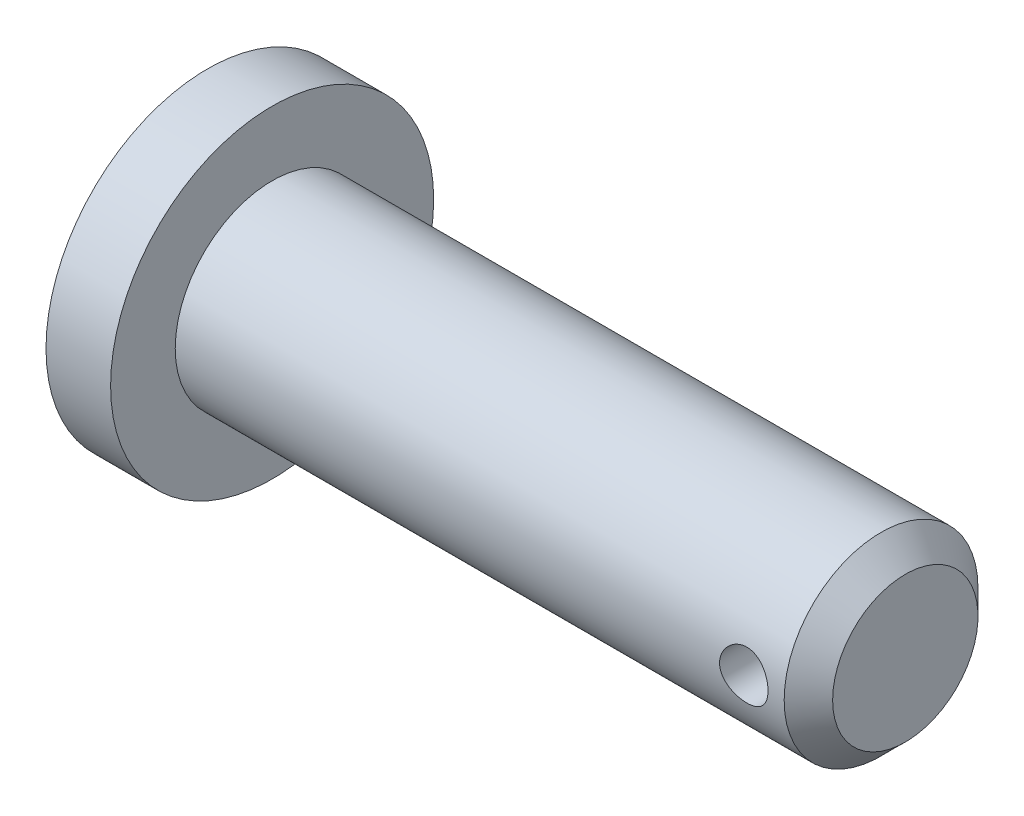
ISO-10303-21;
HEADER;
FILE_DESCRIPTION(('STEP AP214'),'2;1');
FILE_NAME('part.step','',(''),(''),'','','');
FILE_SCHEMA(('AUTOMOTIVE_DESIGN { 1 0 10303 214 1 1 1 1 }'));
ENDSEC;
DATA;
#1=APPLICATION_CONTEXT('core data for automotive mechanical design processes');
#2=APPLICATION_PROTOCOL_DEFINITION('international standard','automotive_design',2000,#1);
#3=PRODUCT_CONTEXT('',#1,'mechanical');
#4=PRODUCT('Part','Part','',(#3));
#5=PRODUCT_RELATED_PRODUCT_CATEGORY('part','',(#4));
#6=PRODUCT_DEFINITION_FORMATION('','',#4);
#7=PRODUCT_DEFINITION_CONTEXT('part definition',#1,'design');
#8=PRODUCT_DEFINITION('design','',#6,#7);
#9=PRODUCT_DEFINITION_SHAPE('','',#8);
#10=(LENGTH_UNIT() NAMED_UNIT(*) SI_UNIT(.MILLI.,.METRE.));
#11=(NAMED_UNIT(*) PLANE_ANGLE_UNIT() SI_UNIT($,.RADIAN.));
#12=(NAMED_UNIT(*) SI_UNIT($,.STERADIAN.) SOLID_ANGLE_UNIT());
#13=UNCERTAINTY_MEASURE_WITH_UNIT(LENGTH_MEASURE(1.E-05),#10,'distance_accuracy_value','');
#14=(GEOMETRIC_REPRESENTATION_CONTEXT(3) GLOBAL_UNCERTAINTY_ASSIGNED_CONTEXT((#13)) GLOBAL_UNIT_ASSIGNED_CONTEXT((#10,
#11,#12)) REPRESENTATION_CONTEXT('',''));
#15=CARTESIAN_POINT('',(0.,0.,0.));
#16=DIRECTION('',(0.,0.,1.));
#17=DIRECTION('',(1.,0.,0.));
#18=AXIS2_PLACEMENT_3D('',#15,#16,#17);
#19=CARTESIAN_POINT('',(-34.29,0.,0.));
#20=DIRECTION('',(1.,0.,0.));
#21=DIRECTION('',(0.,0.,-1.));
#22=AXIS2_PLACEMENT_3D('',#19,#20,#21);
#23=PLANE('',#22);
#24=CARTESIAN_POINT('',(-34.29,0.,0.));
#25=DIRECTION('',(-1.,0.,0.));
#26=DIRECTION('',(0.,0.,1.));
#27=AXIS2_PLACEMENT_3D('',#24,#25,#26);
#28=CIRCLE('',#27,15.875);
#29=CARTESIAN_POINT('',(-34.29,0.,15.875));
#30=VERTEX_POINT('',#29);
#31=EDGE_CURVE('E41',#30,#30,#28,.T.);
#32=ORIENTED_EDGE('',*,*,#31,.T.);
#33=EDGE_LOOP('',(#32));
#34=FACE_BOUND('',#33,.T.);
#35=ADVANCED_FACE('F30',(#34),#23,.F.);
#36=CARTESIAN_POINT('',(-34.29,0.,0.));
#37=DIRECTION('',(-1.,0.,0.));
#38=DIRECTION('',(0.,0.,1.));
#39=AXIS2_PLACEMENT_3D('',#36,#37,#38);
#40=CYLINDRICAL_SURFACE('',#39,15.875);
#41=ORIENTED_EDGE('',*,*,#31,.F.);
#42=EDGE_LOOP('',(#41));
#43=FACE_BOUND('',#42,.T.);
#44=CARTESIAN_POINT('',(-27.94,0.,0.));
#45=DIRECTION('',(-1.,0.,0.));
#46=DIRECTION('',(0.,0.,1.));
#47=AXIS2_PLACEMENT_3D('',#44,#45,#46);
#48=CIRCLE('',#47,15.875);
#49=CARTESIAN_POINT('',(-27.94,0.,15.875));
#50=VERTEX_POINT('',#49);
#51=EDGE_CURVE('E45',#50,#50,#48,.T.);
#52=ORIENTED_EDGE('',*,*,#51,.T.);
#53=EDGE_LOOP('',(#52));
#54=FACE_BOUND('',#53,.T.);
#55=ADVANCED_FACE('F75',(#43,#54),#40,.T.);
#56=CARTESIAN_POINT('',(-27.94,15.875,0.));
#57=DIRECTION('',(-1.,0.,0.));
#58=DIRECTION('',(0.,0.,1.));
#59=AXIS2_PLACEMENT_3D('',#56,#57,#58);
#60=PLANE('',#59);
#61=ORIENTED_EDGE('',*,*,#51,.F.);
#62=EDGE_LOOP('',(#61));
#63=FACE_BOUND('',#62,.T.);
#64=CARTESIAN_POINT('',(-27.94,0.,0.));
#65=DIRECTION('',(-1.,0.,0.));
#66=DIRECTION('',(0.,0.,1.));
#67=AXIS2_PLACEMENT_3D('',#64,#65,#66);
#68=CIRCLE('',#67,9.525);
#69=CARTESIAN_POINT('',(-27.94,0.,9.525));
#70=VERTEX_POINT('',#69);
#71=EDGE_CURVE('E55',#70,#70,#68,.T.);
#72=ORIENTED_EDGE('',*,*,#71,.T.);
#73=EDGE_LOOP('',(#72));
#74=FACE_BOUND('',#73,.T.);
#75=ADVANCED_FACE('F73',(#63,#74),#60,.F.);
#76=CARTESIAN_POINT('',(-34.29,0.,0.));
#77=DIRECTION('',(-1.,0.,0.));
#78=DIRECTION('',(0.,0.,1.));
#79=AXIS2_PLACEMENT_3D('',#76,#77,#78);
#80=CYLINDRICAL_SURFACE('',#79,9.525);
#81=CARTESIAN_POINT('',(31.90875,0.,0.));
#82=DIRECTION('',(-1.,0.,0.));
#83=DIRECTION('',(0.,0.,1.));
#84=AXIS2_PLACEMENT_3D('',#81,#82,#83);
#85=CIRCLE('',#84,9.525);
#86=CARTESIAN_POINT('',(31.90875,0.,9.525));
#87=VERTEX_POINT('',#86);
#88=EDGE_CURVE('E37',#87,#87,#85,.T.);
#89=ORIENTED_EDGE('',*,*,#88,.T.);
#90=EDGE_LOOP('',(#89));
#91=FACE_BOUND('',#90,.T.);
#92=CARTESIAN_POINT('',(30.32125,0.,9.525));
#93=CARTESIAN_POINT('',(30.3212463078907,-0.131565790763198,9.52499777540469));
#94=CARTESIAN_POINT('',(30.3103096631466,-0.263172825556336,9.52224692784274));
#95=CARTESIAN_POINT('',(30.2669175723001,-0.522615038985721,9.51153980704957));
#96=CARTESIAN_POINT('',(30.2344499298587,-0.650448036907299,9.50358058354212));
#97=CARTESIAN_POINT('',(30.1491026851289,-0.898558134589841,9.48333806802101));
#98=CARTESIAN_POINT('',(30.0962475945395,-1.01884410694513,9.47105997011768));
#99=CARTESIAN_POINT('',(29.9717120433038,-1.24884200939828,9.44348733294599));
#100=CARTESIAN_POINT('',(29.9000309476611,-1.35855358265366,9.42819269193473));
#101=CARTESIAN_POINT('',(29.738318746424,-1.5665480595902,9.39589519076813));
#102=CARTESIAN_POINT('',(29.6479728747525,-1.66458215797193,9.3788659759765));
#103=CARTESIAN_POINT('',(29.4521696247069,-1.84427642193527,9.34519371937224));
#104=CARTESIAN_POINT('',(29.3467105423217,-1.92593473865684,9.32855072135165));
#105=CARTESIAN_POINT('',(29.121742577555,-2.07172963669337,9.29726956420843));
#106=CARTESIAN_POINT('',(29.0020482460911,-2.13558789278116,9.28266486212887));
#107=CARTESIAN_POINT('',(28.7531993964897,-2.24218009232431,9.25749823023601));
#108=CARTESIAN_POINT('',(28.6240463945854,-2.28491741301122,9.24693565414889));
#109=CARTESIAN_POINT('',(28.3626821966049,-2.34720580342757,9.23132006755413));
#110=CARTESIAN_POINT('',(28.2305841025397,-2.36720422597714,9.22616091957755));
#111=CARTESIAN_POINT('',(27.9648148967135,-2.38484056791792,9.22161862904601));
#112=CARTESIAN_POINT('',(27.8311440444012,-2.38248212513625,9.22223454679337));
#113=CARTESIAN_POINT('',(27.5694524052042,-2.35582860786553,9.22907738757947));
#114=CARTESIAN_POINT('',(27.4413732009238,-2.33206661505263,9.23516795024078));
#115=CARTESIAN_POINT('',(27.1910793316787,-2.2641308967085,9.25205651602822));
#116=CARTESIAN_POINT('',(27.0688650851916,-2.21995571703516,9.26285485451166));
#117=CARTESIAN_POINT('',(26.8323408991997,-2.11199329622528,9.28806743325234));
#118=CARTESIAN_POINT('',(26.718123202284,-2.04801258423226,9.30251707358333));
#119=CARTESIAN_POINT('',(26.501854048261,-1.90239058817373,9.33338415968011));
#120=CARTESIAN_POINT('',(26.3998047249432,-1.82074621373403,9.34980194956222));
#121=CARTESIAN_POINT('',(26.2077142600851,-1.63935318668144,9.38332960357078));
#122=CARTESIAN_POINT('',(26.1180984970276,-1.5391546848383,9.40044585296326));
#123=CARTESIAN_POINT('',(25.9568612775885,-1.32494641903712,9.43301970356275));
#124=CARTESIAN_POINT('',(25.8852403708566,-1.21093623336136,9.44847725409684));
#125=CARTESIAN_POINT('',(25.7618696943688,-0.971733973281711,9.47606899699527));
#126=CARTESIAN_POINT('',(25.7101890223461,-0.84650483671869,9.48819159202767));
#127=CARTESIAN_POINT('',(25.628731277186,-0.588765662926826,9.50766318223874));
#128=CARTESIAN_POINT('',(25.5989500141862,-0.456257023651393,9.51501309051108));
#129=CARTESIAN_POINT('',(25.5627861146753,-0.191357202994166,9.52397605093307));
#130=CARTESIAN_POINT('',(25.5558241961054,-0.0590497929812821,9.5257310994439));
#131=CARTESIAN_POINT('',(25.5639077907631,0.204839688747396,9.52371102642943));
#132=CARTESIAN_POINT('',(25.5789513229436,0.336421824685797,9.51993640271441));
#133=CARTESIAN_POINT('',(25.6301413170713,0.59311265168268,9.50737210039669));
#134=CARTESIAN_POINT('',(25.6659717557697,0.718288376362892,9.49865756769938));
#135=CARTESIAN_POINT('',(25.7573574958952,0.96084595176837,9.47719571781724));
#136=CARTESIAN_POINT('',(25.8129147893472,1.07822701396434,9.46444799337342));
#137=CARTESIAN_POINT('',(25.9432998545885,1.30416797590736,9.43599376332878));
#138=CARTESIAN_POINT('',(26.0184520784295,1.41253438891428,9.42023876944477));
#139=CARTESIAN_POINT('',(26.1854789802155,1.61532349915876,9.38759408335556));
#140=CARTESIAN_POINT('',(26.277356544143,1.70974378487003,9.37070419564053));
#141=CARTESIAN_POINT('',(26.4779156128394,1.88434752681507,9.33718219173204));
#142=CARTESIAN_POINT('',(26.5869542285118,1.9641246398485,9.32056657889684));
#143=CARTESIAN_POINT('',(26.8172130572189,2.10424832993413,9.28993694431491));
#144=CARTESIAN_POINT('',(26.9384327292156,2.16459576948123,9.27592280709881));
#145=CARTESIAN_POINT('',(27.1889628343199,2.26369788021415,9.25223725362918));
#146=CARTESIAN_POINT('',(27.3182201099458,2.30258047967169,9.24254017670458));
#147=CARTESIAN_POINT('',(27.5817165500953,2.35798623515941,9.22856206138023));
#148=CARTESIAN_POINT('',(27.7159546184965,2.37451428111801,9.22427983852602));
#149=CARTESIAN_POINT('',(27.9814671253803,2.38448626215919,9.22170655688286));
#150=CARTESIAN_POINT('',(28.1127159282632,2.378579662727,9.22324693213353));
#151=CARTESIAN_POINT('',(28.3722824232577,2.34533642932061,9.23175555542716));
#152=CARTESIAN_POINT('',(28.5006001742209,2.31800022601496,9.23872369438889));
#153=CARTESIAN_POINT('',(28.749955928767,2.24302846961572,9.25720876335744));
#154=CARTESIAN_POINT('',(28.871032722069,2.19551472993017,9.26869836688157));
#155=CARTESIAN_POINT('',(29.1035825450578,2.08163305034797,9.2949356221265));
#156=CARTESIAN_POINT('',(29.2150542399342,2.01526249542925,9.30968372566587));
#157=CARTESIAN_POINT('',(29.4283679735408,1.86351505096148,9.34125694393469));
#158=CARTESIAN_POINT('',(29.5298829540605,1.77768752112321,9.35812620420453));
#159=CARTESIAN_POINT('',(29.7172809336127,1.5903406267637,9.3917774325344));
#160=CARTESIAN_POINT('',(29.8031602153043,1.48881754125207,9.40855937891697));
#161=CARTESIAN_POINT('',(29.9583654523463,1.27074229389037,9.44050778340675));
#162=CARTESIAN_POINT('',(30.0273634492036,1.15395124542727,9.45563947968319));
#163=CARTESIAN_POINT('',(30.1446365974181,0.910059869472881,9.48221568397998));
#164=CARTESIAN_POINT('',(30.1929265975295,0.782967006955824,9.49366283254652));
#165=CARTESIAN_POINT('',(30.2602452806483,0.546751277024011,9.50988794560298));
#166=CARTESIAN_POINT('',(30.2830725983473,0.438753521316558,9.51551603771146));
#167=CARTESIAN_POINT('',(30.3135759354998,0.220513388563849,9.52307285805718));
#168=CARTESIAN_POINT('',(30.3212530945222,0.110271180972653,9.52500186453295));
#169=CARTESIAN_POINT('',(30.32125,0.,9.525));
#170=B_SPLINE_CURVE_WITH_KNOTS('',3,(#92,#93,#94,#95,#96,#97,#98,#99,#100,#101,#102,#103,#104,
#105,#106,#107,#108,#109,#110,#111,#112,#113,#114,#115,#116,#117,#118,#119,#120,#121,#122,#123,
#124,#125,#126,#127,#128,#129,#130,#131,#132,#133,#134,#135,#136,#137,#138,#139,#140,#141,#142,
#143,#144,#145,#146,#147,#148,#149,#150,#151,#152,#153,#154,#155,#156,#157,#158,#159,#160,#161,
#162,#163,#164,#165,#166,#167,#168,#169),.UNSPECIFIED.,.T.,.F.,(4,2,2,2,2,2,2,2,2,2,2,2,2,2,2,2,
2,2,2,2,2,2,2,2,2,2,2,2,2,2,2,2,2,2,2,2,2,2,4),(0.,0.394293268549125,0.788810077450191,
1.18285403237919,1.57691128001881,1.97825416256458,2.37964233208348,2.78699352978968,
3.19427957106372,3.59340618472948,3.99246785509178,4.38185714003913,4.77127416757608,
5.16462213005055,5.5580389670768,5.9626738279359,6.36732104678989,6.77335813557241,
7.17931751985993,7.57488815462248,7.97042318021751,8.36009685796307,8.74980989629409,
9.14643820265269,9.54313501280503,9.94956908367378,10.3559851102012,10.75995204207,
11.1638305942253,11.5561075139213,11.9483765502704,12.3383103589746,12.7282982692666,
13.1284595256007,13.5287157951987,13.9362209448993,14.3434334007573,14.6739331067999,
15.0044079522766),.UNSPECIFIED.);
#171=CARTESIAN_POINT('',(30.32125,0.,9.525));
#172=VERTEX_POINT('',#171);
#173=EDGE_CURVE('E48',#172,#172,#170,.T.);
#174=ORIENTED_EDGE('',*,*,#173,.T.);
#175=EDGE_LOOP('',(#174));
#176=FACE_BOUND('',#175,.T.);
#177=CARTESIAN_POINT('',(30.32125,0.,-9.525));
#178=CARTESIAN_POINT('',(30.3212463078907,0.131565790763198,-9.52499777540469));
#179=CARTESIAN_POINT('',(30.3103096631466,0.263172825556337,-9.52224692784274));
#180=CARTESIAN_POINT('',(30.2669175723001,0.522615038985721,-9.51153980704957));
#181=CARTESIAN_POINT('',(30.2344499298587,0.650448036907299,-9.50358058354212));
#182=CARTESIAN_POINT('',(30.1491026851289,0.898558134589842,-9.48333806802101));
#183=CARTESIAN_POINT('',(30.0962475945395,1.01884410694513,-9.47105997011768));
#184=CARTESIAN_POINT('',(29.9717120433038,1.24884200939828,-9.44348733294599));
#185=CARTESIAN_POINT('',(29.9000309476611,1.35855358265366,-9.42819269193473));
#186=CARTESIAN_POINT('',(29.738318746424,1.5665480595902,-9.39589519076813));
#187=CARTESIAN_POINT('',(29.6479728747525,1.66458215797193,-9.3788659759765));
#188=CARTESIAN_POINT('',(29.4521696247069,1.84427642193527,-9.34519371937224));
#189=CARTESIAN_POINT('',(29.3467105423217,1.92593473865684,-9.32855072135165));
#190=CARTESIAN_POINT('',(29.121742577555,2.07172963669338,-9.29726956420842));
#191=CARTESIAN_POINT('',(29.0020482460911,2.13558789278116,-9.28266486212887));
#192=CARTESIAN_POINT('',(28.7531993964897,2.24218009232431,-9.25749823023601));
#193=CARTESIAN_POINT('',(28.6240463945854,2.28491741301123,-9.24693565414889));
#194=CARTESIAN_POINT('',(28.3626821966049,2.34720580342757,-9.23132006755413));
#195=CARTESIAN_POINT('',(28.2305841025397,2.36720422597714,-9.22616091957755));
#196=CARTESIAN_POINT('',(27.9648148967135,2.38484056791792,-9.22161862904601));
#197=CARTESIAN_POINT('',(27.8311440444012,2.38248212513625,-9.22223454679337));
#198=CARTESIAN_POINT('',(27.5694524052042,2.35582860786553,-9.22907738757947));
#199=CARTESIAN_POINT('',(27.4413732009238,2.33206661505263,-9.23516795024078));
#200=CARTESIAN_POINT('',(27.1910793316787,2.2641308967085,-9.25205651602822));
#201=CARTESIAN_POINT('',(27.0688650851916,2.21995571703516,-9.26285485451166));
#202=CARTESIAN_POINT('',(26.8323408991997,2.11199329622528,-9.28806743325234));
#203=CARTESIAN_POINT('',(26.718123202284,2.04801258423226,-9.30251707358333));
#204=CARTESIAN_POINT('',(26.501854048261,1.90239058817373,-9.33338415968011));
#205=CARTESIAN_POINT('',(26.3998047249432,1.82074621373403,-9.34980194956222));
#206=CARTESIAN_POINT('',(26.2077142600851,1.63935318668144,-9.38332960357078));
#207=CARTESIAN_POINT('',(26.1180984970276,1.5391546848383,-9.40044585296326));
#208=CARTESIAN_POINT('',(25.9568612775885,1.32494641903712,-9.43301970356275));
#209=CARTESIAN_POINT('',(25.8852403708566,1.21093623336136,-9.44847725409684));
#210=CARTESIAN_POINT('',(25.7618696943688,0.971733973281711,-9.47606899699527));
#211=CARTESIAN_POINT('',(25.7101890223461,0.84650483671869,-9.48819159202767));
#212=CARTESIAN_POINT('',(25.628731277186,0.588765662926826,-9.50766318223874));
#213=CARTESIAN_POINT('',(25.5989500141862,0.456257023651393,-9.51501309051108));
#214=CARTESIAN_POINT('',(25.5627861146753,0.191357202994166,-9.52397605093307));
#215=CARTESIAN_POINT('',(25.5558241961054,0.0590497929812826,-9.5257310994439));
#216=CARTESIAN_POINT('',(25.5639077907631,-0.204839688747395,-9.52371102642943));
#217=CARTESIAN_POINT('',(25.5789513229436,-0.336421824685797,-9.51993640271441));
#218=CARTESIAN_POINT('',(25.6301413170713,-0.59311265168268,-9.50737210039669));
#219=CARTESIAN_POINT('',(25.6659717557697,-0.718288376362892,-9.49865756769938));
#220=CARTESIAN_POINT('',(25.7573574958952,-0.960845951768371,-9.47719571781724));
#221=CARTESIAN_POINT('',(25.8129147893472,-1.07822701396434,-9.46444799337342));
#222=CARTESIAN_POINT('',(25.9432998545885,-1.30416797590736,-9.43599376332878));
#223=CARTESIAN_POINT('',(26.0184520784295,-1.41253438891428,-9.42023876944477));
#224=CARTESIAN_POINT('',(26.1854789802155,-1.61532349915876,-9.38759408335556));
#225=CARTESIAN_POINT('',(26.277356544143,-1.70974378487003,-9.37070419564053));
#226=CARTESIAN_POINT('',(26.4779156128394,-1.88434752681507,-9.33718219173204));
#227=CARTESIAN_POINT('',(26.5869542285118,-1.9641246398485,-9.32056657889684));
#228=CARTESIAN_POINT('',(26.8172130572189,-2.10424832993413,-9.28993694431491));
#229=CARTESIAN_POINT('',(26.9384327292156,-2.16459576948123,-9.27592280709881));
#230=CARTESIAN_POINT('',(27.1889628343199,-2.26369788021415,-9.25223725362918));
#231=CARTESIAN_POINT('',(27.3182201099458,-2.30258047967169,-9.24254017670458));
#232=CARTESIAN_POINT('',(27.5817165500953,-2.35798623515941,-9.22856206138023));
#233=CARTESIAN_POINT('',(27.7159546184965,-2.37451428111801,-9.22427983852602));
#234=CARTESIAN_POINT('',(27.9814671253803,-2.38448626215919,-9.22170655688286));
#235=CARTESIAN_POINT('',(28.1127159282632,-2.378579662727,-9.22324693213353));
#236=CARTESIAN_POINT('',(28.3722824232577,-2.34533642932061,-9.23175555542716));
#237=CARTESIAN_POINT('',(28.5006001742209,-2.31800022601496,-9.23872369438889));
#238=CARTESIAN_POINT('',(28.749955928767,-2.24302846961572,-9.25720876335744));
#239=CARTESIAN_POINT('',(28.871032722069,-2.19551472993017,-9.26869836688157));
#240=CARTESIAN_POINT('',(29.1035825450578,-2.08163305034797,-9.2949356221265));
#241=CARTESIAN_POINT('',(29.2150542399342,-2.01526249542925,-9.30968372566587));
#242=CARTESIAN_POINT('',(29.4283679735408,-1.86351505096148,-9.34125694393469));
#243=CARTESIAN_POINT('',(29.5298829540605,-1.77768752112321,-9.35812620420453));
#244=CARTESIAN_POINT('',(29.7172809336127,-1.5903406267637,-9.3917774325344));
#245=CARTESIAN_POINT('',(29.8031602153043,-1.48881754125207,-9.40855937891697));
#246=CARTESIAN_POINT('',(29.9583654523463,-1.27074229389037,-9.44050778340675));
#247=CARTESIAN_POINT('',(30.0273634492036,-1.15395124542727,-9.45563947968319));
#248=CARTESIAN_POINT('',(30.1446365974181,-0.910059869472881,-9.48221568397998));
#249=CARTESIAN_POINT('',(30.1929265975295,-0.782967006955824,-9.49366283254652));
#250=CARTESIAN_POINT('',(30.2602452806483,-0.546751277024011,-9.50988794560298));
#251=CARTESIAN_POINT('',(30.2830725983473,-0.438753521316559,-9.51551603771146));
#252=CARTESIAN_POINT('',(30.3135759354998,-0.220513388563849,-9.52307285805718));
#253=CARTESIAN_POINT('',(30.3212530945222,-0.110271180972653,-9.52500186453295));
#254=CARTESIAN_POINT('',(30.32125,0.,-9.525));
#255=B_SPLINE_CURVE_WITH_KNOTS('',3,(#177,#178,#179,#180,#181,#182,#183,#184,#185,#186,#187,
#188,#189,#190,#191,#192,#193,#194,#195,#196,#197,#198,#199,#200,#201,#202,#203,#204,#205,#206,
#207,#208,#209,#210,#211,#212,#213,#214,#215,#216,#217,#218,#219,#220,#221,#222,#223,#224,#225,
#226,#227,#228,#229,#230,#231,#232,#233,#234,#235,#236,#237,#238,#239,#240,#241,#242,#243,#244,
#245,#246,#247,#248,#249,#250,#251,#252,#253,#254),.UNSPECIFIED.,.T.,.F.,(4,2,2,2,2,2,2,2,2,2,2,
2,2,2,2,2,2,2,2,2,2,2,2,2,2,2,2,2,2,2,2,2,2,2,2,2,2,2,4),(0.,0.394293268549125,
0.788810077450191,1.1828540323792,1.57691128001881,1.97825416256458,2.37964233208349,
2.78699352978969,3.19427957106372,3.59340618472948,3.99246785509178,4.38185714003912,
4.77127416757608,5.16462213005055,5.5580389670768,5.9626738279359,6.36732104678989,
6.77335813557241,7.17931751985993,7.57488815462248,7.97042318021751,8.36009685796307,
8.74980989629409,9.14643820265269,9.54313501280503,9.94956908367378,10.3559851102012,
10.75995204207,11.1638305942253,11.5561075139213,11.9483765502704,12.3383103589746,
12.7282982692666,13.1284595256007,13.5287157951987,13.9362209448993,14.3434334007573,
14.6739331067999,15.0044079522766),.UNSPECIFIED.);
#256=CARTESIAN_POINT('',(30.32125,0.,-9.525));
#257=VERTEX_POINT('',#256);
#258=EDGE_CURVE('E56',#257,#257,#255,.T.);
#259=ORIENTED_EDGE('',*,*,#258,.T.);
#260=EDGE_LOOP('',(#259));
#261=FACE_BOUND('',#260,.T.);
#262=ORIENTED_EDGE('',*,*,#71,.F.);
#263=EDGE_LOOP('',(#262));
#264=FACE_BOUND('',#263,.T.);
#265=ADVANCED_FACE('F59',(#91,#176,#261,#264),#80,.T.);
#266=CARTESIAN_POINT('',(34.29,9.525,0.));
#267=DIRECTION('',(-1.,0.,0.));
#268=DIRECTION('',(0.,0.,1.));
#269=AXIS2_PLACEMENT_3D('',#266,#267,#268);
#270=PLANE('',#269);
#271=CARTESIAN_POINT('',(34.29,0.,0.));
#272=DIRECTION('',(-1.,0.,0.));
#273=DIRECTION('',(0.,0.,1.));
#274=AXIS2_PLACEMENT_3D('',#271,#272,#273);
#275=CIRCLE('',#274,7.14375000000003);
#276=CARTESIAN_POINT('',(34.29,0.,7.14375000000003));
#277=VERTEX_POINT('',#276);
#278=EDGE_CURVE('E10',#277,#277,#275,.F.);
#279=ORIENTED_EDGE('',*,*,#278,.T.);
#280=EDGE_LOOP('',(#279));
#281=FACE_BOUND('',#280,.T.);
#282=ADVANCED_FACE('F66',(#281),#270,.F.);
#283=CARTESIAN_POINT('',(27.94,0.,-15.875));
#284=DIRECTION('',(0.,0.,1.));
#285=DIRECTION('',(1.,0.,0.));
#286=AXIS2_PLACEMENT_3D('',#283,#284,#285);
#287=CYLINDRICAL_SURFACE('',#286,2.38125);
#288=ORIENTED_EDGE('',*,*,#258,.F.);
#289=EDGE_LOOP('',(#288));
#290=FACE_BOUND('',#289,.T.);
#291=ORIENTED_EDGE('',*,*,#173,.F.);
#292=EDGE_LOOP('',(#291));
#293=FACE_BOUND('',#292,.T.);
#294=ADVANCED_FACE('F63',(#290,#293),#287,.F.);
#295=CARTESIAN_POINT('',(31.90875,0.,0.));
#296=DIRECTION('',(-1.,0.,0.));
#297=DIRECTION('',(0.,0.,1.));
#298=AXIS2_PLACEMENT_3D('',#295,#296,#297);
#299=CONICAL_SURFACE('',#298,9.525,0.78539816339745);
#300=ORIENTED_EDGE('',*,*,#278,.F.);
#301=EDGE_LOOP('',(#300));
#302=FACE_BOUND('',#301,.T.);
#303=ORIENTED_EDGE('',*,*,#88,.F.);
#304=EDGE_LOOP('',(#303));
#305=FACE_BOUND('',#304,.T.);
#306=ADVANCED_FACE('F32',(#302,#305),#299,.T.);
#307=CLOSED_SHELL('',(#35,#55,#75,#265,#282,#294,#306));
#308=MANIFOLD_SOLID_BREP('B2',#307);
#309=ADVANCED_BREP_SHAPE_REPRESENTATION('',(#18,#308),#14);
#310=SHAPE_DEFINITION_REPRESENTATION(#9,#309);
ENDSEC;
END-ISO-10303-21;
